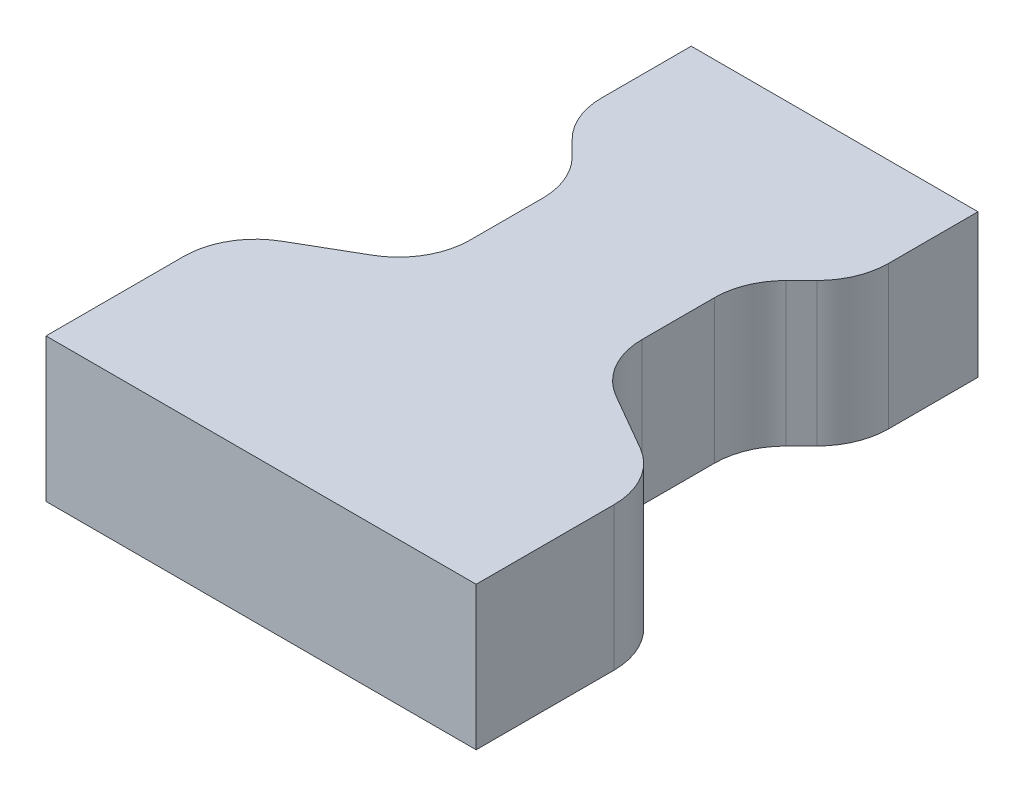
ISO-10303-21;
HEADER;
FILE_DESCRIPTION(('STEP AP214'),'2;1');
FILE_NAME('part.step','',(''),(''),'','','');
FILE_SCHEMA(('AUTOMOTIVE_DESIGN { 1 0 10303 214 1 1 1 1 }'));
ENDSEC;
DATA;
#1=APPLICATION_CONTEXT('core data for automotive mechanical design processes');
#2=APPLICATION_PROTOCOL_DEFINITION('international standard','automotive_design',2000,#1);
#3=PRODUCT_CONTEXT('',#1,'mechanical');
#4=PRODUCT('Part','Part','',(#3));
#5=PRODUCT_RELATED_PRODUCT_CATEGORY('part','',(#4));
#6=PRODUCT_DEFINITION_FORMATION('','',#4);
#7=PRODUCT_DEFINITION_CONTEXT('part definition',#1,'design');
#8=PRODUCT_DEFINITION('design','',#6,#7);
#9=PRODUCT_DEFINITION_SHAPE('','',#8);
#10=(LENGTH_UNIT() NAMED_UNIT(*) SI_UNIT(.MILLI.,.METRE.));
#11=(NAMED_UNIT(*) PLANE_ANGLE_UNIT() SI_UNIT($,.RADIAN.));
#12=(NAMED_UNIT(*) SI_UNIT($,.STERADIAN.) SOLID_ANGLE_UNIT());
#13=UNCERTAINTY_MEASURE_WITH_UNIT(LENGTH_MEASURE(1.E-05),#10,'distance_accuracy_value','');
#14=(GEOMETRIC_REPRESENTATION_CONTEXT(3) GLOBAL_UNCERTAINTY_ASSIGNED_CONTEXT((#13)) GLOBAL_UNIT_ASSIGNED_CONTEXT((#10,
#11,#12)) REPRESENTATION_CONTEXT('',''));
#15=CARTESIAN_POINT('',(0.,0.,0.));
#16=DIRECTION('',(0.,0.,1.));
#17=DIRECTION('',(1.,0.,0.));
#18=AXIS2_PLACEMENT_3D('',#15,#16,#17);
#19=CARTESIAN_POINT('',(300.,100.,0.));
#20=DIRECTION('',(-1.,0.,0.));
#21=DIRECTION('',(0.,0.,1.));
#22=AXIS2_PLACEMENT_3D('',#19,#20,#21);
#23=PLANE('',#22);
#24=DIRECTION('',(0.,0.,-1.));
#25=VECTOR('',#24,1.);
#26=CARTESIAN_POINT('',(300.,-100.,0.));
#27=LINE('',#26,#25);
#28=CARTESIAN_POINT('',(300.,-100.,0.));
#29=VERTEX_POINT('',#28);
#30=CARTESIAN_POINT('',(300.,-100.,-192.264973081037));
#31=VERTEX_POINT('',#30);
#32=EDGE_CURVE('E212',#29,#31,#27,.T.);
#33=ORIENTED_EDGE('',*,*,#32,.T.);
#34=DIRECTION('',(0.,-1.,0.));
#35=VECTOR('',#34,1.);
#36=CARTESIAN_POINT('',(300.,100.,-192.264973081037));
#37=LINE('',#36,#35);
#38=CARTESIAN_POINT('',(300.,100.,-192.264973081037));
#39=VERTEX_POINT('',#38);
#40=EDGE_CURVE('E11',#39,#31,#37,.T.);
#41=ORIENTED_EDGE('',*,*,#40,.F.);
#42=DIRECTION('',(0.,0.,-1.));
#43=VECTOR('',#42,1.);
#44=CARTESIAN_POINT('',(300.,100.,0.));
#45=LINE('',#44,#43);
#46=CARTESIAN_POINT('',(300.,100.,0.));
#47=VERTEX_POINT('',#46);
#48=EDGE_CURVE('E270',#47,#39,#45,.T.);
#49=ORIENTED_EDGE('',*,*,#48,.F.);
#50=DIRECTION('',(0.,-1.,0.));
#51=VECTOR('',#50,1.);
#52=CARTESIAN_POINT('',(300.,100.,0.));
#53=LINE('',#52,#51);
#54=EDGE_CURVE('E208',#47,#29,#53,.T.);
#55=ORIENTED_EDGE('',*,*,#54,.T.);
#56=EDGE_LOOP('',(#33,#41,#49,#55));
#57=FACE_BOUND('',#56,.T.);
#58=ADVANCED_FACE('F39',(#57),#23,.F.);
#59=CARTESIAN_POINT('',(200.,100.,-192.264973081037));
#60=DIRECTION('',(0.,-1.,0.));
#61=DIRECTION('',(0.,0.,-1.));
#62=AXIS2_PLACEMENT_3D('',#59,#60,#61);
#63=CYLINDRICAL_SURFACE('',#62,100.);
#64=CARTESIAN_POINT('',(200.,-100.,-192.264973081037));
#65=DIRECTION('',(0.,1.,0.));
#66=DIRECTION('',(0.,0.,-1.));
#67=AXIS2_PLACEMENT_3D('',#64,#65,#66);
#68=CIRCLE('',#67,100.);
#69=CARTESIAN_POINT('',(250.,-100.,-278.867513459481));
#70=VERTEX_POINT('',#69);
#71=EDGE_CURVE('E216',#31,#70,#68,.T.);
#72=ORIENTED_EDGE('',*,*,#71,.T.);
#73=DIRECTION('',(0.,-1.,0.));
#74=VECTOR('',#73,1.);
#75=CARTESIAN_POINT('',(250.,100.,-278.867513459481));
#76=LINE('',#75,#74);
#77=CARTESIAN_POINT('',(250.,100.,-278.867513459481));
#78=VERTEX_POINT('',#77);
#79=EDGE_CURVE('E48',#78,#70,#76,.T.);
#80=ORIENTED_EDGE('',*,*,#79,.F.);
#81=CARTESIAN_POINT('',(200.,100.,-192.264973081037));
#82=DIRECTION('',(0.,1.,0.));
#83=DIRECTION('',(0.,0.,-1.));
#84=AXIS2_PLACEMENT_3D('',#81,#82,#83);
#85=CIRCLE('',#84,100.);
#86=EDGE_CURVE('E135',#39,#78,#85,.T.);
#87=ORIENTED_EDGE('',*,*,#86,.F.);
#88=ORIENTED_EDGE('',*,*,#40,.T.);
#89=EDGE_LOOP('',(#72,#80,#87,#88));
#90=FACE_BOUND('',#89,.T.);
#91=ADVANCED_FACE('F420',(#90),#63,.T.);
#92=CARTESIAN_POINT('',(250.,100.,-278.867513459481));
#93=DIRECTION('',(-0.499999999999997,0.,0.86602540378444));
#94=DIRECTION('',(0.86602540378444,0.,0.499999999999997));
#95=AXIS2_PLACEMENT_3D('',#92,#93,#94);
#96=PLANE('',#95);
#97=DIRECTION('',(-0.86602540378444,0.,-0.499999999999997));
#98=VECTOR('',#97,1.);
#99=CARTESIAN_POINT('',(250.,-100.,-278.867513459481));
#100=LINE('',#99,#98);
#101=CARTESIAN_POINT('',(170.,-100.,-325.055534994651));
#102=VERTEX_POINT('',#101);
#103=EDGE_CURVE('E219',#70,#102,#100,.T.);
#104=ORIENTED_EDGE('',*,*,#103,.T.);
#105=DIRECTION('',(0.,-1.,0.));
#106=VECTOR('',#105,1.);
#107=CARTESIAN_POINT('',(170.,100.,-325.055534994651));
#108=LINE('',#107,#106);
#109=CARTESIAN_POINT('',(170.,100.,-325.055534994651));
#110=VERTEX_POINT('',#109);
#111=EDGE_CURVE('E329',#110,#102,#108,.T.);
#112=ORIENTED_EDGE('',*,*,#111,.F.);
#113=DIRECTION('',(-0.86602540378444,0.,-0.499999999999997));
#114=VECTOR('',#113,1.);
#115=CARTESIAN_POINT('',(250.,100.,-278.867513459481));
#116=LINE('',#115,#114);
#117=EDGE_CURVE('E339',#78,#110,#116,.T.);
#118=ORIENTED_EDGE('',*,*,#117,.F.);
#119=ORIENTED_EDGE('',*,*,#79,.T.);
#120=EDGE_LOOP('',(#104,#112,#118,#119));
#121=FACE_BOUND('',#120,.T.);
#122=ADVANCED_FACE('F337',(#121),#96,.F.);
#123=CARTESIAN_POINT('',(220.,100.,-411.658075373095));
#124=DIRECTION('',(0.,-1.,0.));
#125=DIRECTION('',(0.,0.,-1.));
#126=AXIS2_PLACEMENT_3D('',#123,#124,#125);
#127=CYLINDRICAL_SURFACE('',#126,100.);
#128=CARTESIAN_POINT('',(220.,-100.,-411.658075373095));
#129=DIRECTION('',(0.,-1.,0.));
#130=DIRECTION('',(0.,0.,-1.));
#131=AXIS2_PLACEMENT_3D('',#128,#129,#130);
#132=CIRCLE('',#131,100.);
#133=CARTESIAN_POINT('',(120.,-100.,-411.658075373095));
#134=VERTEX_POINT('',#133);
#135=EDGE_CURVE('E222',#102,#134,#132,.T.);
#136=ORIENTED_EDGE('',*,*,#135,.T.);
#137=DIRECTION('',(0.,-1.,0.));
#138=VECTOR('',#137,1.);
#139=CARTESIAN_POINT('',(120.,100.,-411.658075373095));
#140=LINE('',#139,#138);
#141=CARTESIAN_POINT('',(120.,100.,-411.658075373095));
#142=VERTEX_POINT('',#141);
#143=EDGE_CURVE('E325',#142,#134,#140,.T.);
#144=ORIENTED_EDGE('',*,*,#143,.F.);
#145=CARTESIAN_POINT('',(220.,100.,-411.658075373095));
#146=DIRECTION('',(0.,-1.,0.));
#147=DIRECTION('',(0.,0.,-1.));
#148=AXIS2_PLACEMENT_3D('',#145,#146,#147);
#149=CIRCLE('',#148,100.);
#150=EDGE_CURVE('E358',#110,#142,#149,.T.);
#151=ORIENTED_EDGE('',*,*,#150,.F.);
#152=ORIENTED_EDGE('',*,*,#111,.T.);
#153=EDGE_LOOP('',(#136,#144,#151,#152));
#154=FACE_BOUND('',#153,.T.);
#155=ADVANCED_FACE('F348',(#154),#127,.F.);
#156=CARTESIAN_POINT('',(120.,100.,-411.658075373095));
#157=DIRECTION('',(-1.,0.,0.));
#158=DIRECTION('',(0.,0.,1.));
#159=AXIS2_PLACEMENT_3D('',#156,#157,#158);
#160=PLANE('',#159);
#161=DIRECTION('',(0.,0.,-1.));
#162=VECTOR('',#161,1.);
#163=CARTESIAN_POINT('',(120.,-100.,-411.658075373095));
#164=LINE('',#163,#162);
#165=CARTESIAN_POINT('',(120.,-100.,-512.501692216822));
#166=VERTEX_POINT('',#165);
#167=EDGE_CURVE('E225',#134,#166,#164,.T.);
#168=ORIENTED_EDGE('',*,*,#167,.T.);
#169=DIRECTION('',(0.,-1.,0.));
#170=VECTOR('',#169,1.);
#171=CARTESIAN_POINT('',(120.,100.,-512.501692216822));
#172=LINE('',#171,#170);
#173=CARTESIAN_POINT('',(120.,100.,-512.501692216822));
#174=VERTEX_POINT('',#173);
#175=EDGE_CURVE('E321',#174,#166,#172,.T.);
#176=ORIENTED_EDGE('',*,*,#175,.F.);
#177=DIRECTION('',(0.,0.,-1.));
#178=VECTOR('',#177,1.);
#179=CARTESIAN_POINT('',(120.,100.,-411.658075373095));
#180=LINE('',#179,#178);
#181=EDGE_CURVE('E354',#142,#174,#180,.T.);
#182=ORIENTED_EDGE('',*,*,#181,.F.);
#183=ORIENTED_EDGE('',*,*,#143,.T.);
#184=EDGE_LOOP('',(#168,#176,#182,#183));
#185=FACE_BOUND('',#184,.T.);
#186=ADVANCED_FACE('F352',(#185),#160,.F.);
#187=CARTESIAN_POINT('',(220.,100.,-512.501692216822));
#188=DIRECTION('',(0.,-1.,0.));
#189=DIRECTION('',(0.,0.,-1.));
#190=AXIS2_PLACEMENT_3D('',#187,#188,#189);
#191=CYLINDRICAL_SURFACE('',#190,100.);
#192=CARTESIAN_POINT('',(220.,-100.,-512.501692216822));
#193=DIRECTION('',(0.,-1.,0.));
#194=DIRECTION('',(0.,0.,-1.));
#195=AXIS2_PLACEMENT_3D('',#192,#193,#194);
#196=CIRCLE('',#195,100.);
#197=CARTESIAN_POINT('',(149.289321881346,-100.,-583.212370335478));
#198=VERTEX_POINT('',#197);
#199=EDGE_CURVE('E228',#166,#198,#196,.T.);
#200=ORIENTED_EDGE('',*,*,#199,.T.);
#201=DIRECTION('',(0.,-1.,0.));
#202=VECTOR('',#201,1.);
#203=CARTESIAN_POINT('',(149.289321881346,100.,-583.212370335478));
#204=LINE('',#203,#202);
#205=CARTESIAN_POINT('',(149.289321881346,100.,-583.212370335478));
#206=VERTEX_POINT('',#205);
#207=EDGE_CURVE('E317',#206,#198,#204,.T.);
#208=ORIENTED_EDGE('',*,*,#207,.F.);
#209=CARTESIAN_POINT('',(220.,100.,-512.501692216822));
#210=DIRECTION('',(0.,-1.,0.));
#211=DIRECTION('',(0.,0.,-1.));
#212=AXIS2_PLACEMENT_3D('',#209,#210,#211);
#213=CIRCLE('',#212,100.);
#214=EDGE_CURVE('E357',#174,#206,#213,.T.);
#215=ORIENTED_EDGE('',*,*,#214,.F.);
#216=ORIENTED_EDGE('',*,*,#175,.T.);
#217=EDGE_LOOP('',(#200,#208,#215,#216));
#218=FACE_BOUND('',#217,.T.);
#219=ADVANCED_FACE('F433',(#218),#191,.F.);
#220=CARTESIAN_POINT('',(149.289321881346,100.,-583.212370335478));
#221=DIRECTION('',(-0.707106781186546,0.,-0.707106781186549));
#222=DIRECTION('',(-0.707106781186549,0.,0.707106781186546));
#223=AXIS2_PLACEMENT_3D('',#220,#221,#222);
#224=PLANE('',#223);
#225=DIRECTION('',(0.707106781186549,0.,-0.707106781186546));
#226=VECTOR('',#225,1.);
#227=CARTESIAN_POINT('',(149.289321881346,-100.,-583.212370335478));
#228=LINE('',#227,#226);
#229=CARTESIAN_POINT('',(170.710678118654,-100.,-604.633726572786));
#230=VERTEX_POINT('',#229);
#231=EDGE_CURVE('E231',#198,#230,#228,.T.);
#232=ORIENTED_EDGE('',*,*,#231,.T.);
#233=DIRECTION('',(0.,-1.,0.));
#234=VECTOR('',#233,1.);
#235=CARTESIAN_POINT('',(170.710678118654,100.,-604.633726572786));
#236=LINE('',#235,#234);
#237=CARTESIAN_POINT('',(170.710678118654,100.,-604.633726572786));
#238=VERTEX_POINT('',#237);
#239=EDGE_CURVE('E313',#238,#230,#236,.T.);
#240=ORIENTED_EDGE('',*,*,#239,.F.);
#241=DIRECTION('',(0.707106781186549,0.,-0.707106781186546));
#242=VECTOR('',#241,1.);
#243=CARTESIAN_POINT('',(149.289321881346,100.,-583.212370335478));
#244=LINE('',#243,#242);
#245=EDGE_CURVE('E362',#206,#238,#244,.T.);
#246=ORIENTED_EDGE('',*,*,#245,.F.);
#247=ORIENTED_EDGE('',*,*,#207,.T.);
#248=EDGE_LOOP('',(#232,#240,#246,#247));
#249=FACE_BOUND('',#248,.T.);
#250=ADVANCED_FACE('F436',(#249),#224,.F.);
#251=CARTESIAN_POINT('',(100.,100.,-675.344404691441));
#252=DIRECTION('',(0.,-1.,0.));
#253=DIRECTION('',(0.,0.,-1.));
#254=AXIS2_PLACEMENT_3D('',#251,#252,#253);
#255=CYLINDRICAL_SURFACE('',#254,100.);
#256=CARTESIAN_POINT('',(100.,-100.,-675.344404691441));
#257=DIRECTION('',(0.,1.,0.));
#258=DIRECTION('',(0.,0.,-1.));
#259=AXIS2_PLACEMENT_3D('',#256,#257,#258);
#260=CIRCLE('',#259,100.);
#261=CARTESIAN_POINT('',(200.,-100.,-675.344404691442));
#262=VERTEX_POINT('',#261);
#263=EDGE_CURVE('E234',#230,#262,#260,.T.);
#264=ORIENTED_EDGE('',*,*,#263,.T.);
#265=DIRECTION('',(0.,-1.,0.));
#266=VECTOR('',#265,1.);
#267=CARTESIAN_POINT('',(200.,100.,-675.344404691442));
#268=LINE('',#267,#266);
#269=CARTESIAN_POINT('',(200.,100.,-675.344404691442));
#270=VERTEX_POINT('',#269);
#271=EDGE_CURVE('E309',#270,#262,#268,.T.);
#272=ORIENTED_EDGE('',*,*,#271,.F.);
#273=CARTESIAN_POINT('',(100.,100.,-675.344404691441));
#274=DIRECTION('',(0.,1.,0.));
#275=DIRECTION('',(0.,0.,-1.));
#276=AXIS2_PLACEMENT_3D('',#273,#274,#275);
#277=CIRCLE('',#276,100.);
#278=EDGE_CURVE('E369',#238,#270,#277,.T.);
#279=ORIENTED_EDGE('',*,*,#278,.F.);
#280=ORIENTED_EDGE('',*,*,#239,.T.);
#281=EDGE_LOOP('',(#264,#272,#279,#280));
#282=FACE_BOUND('',#281,.T.);
#283=ADVANCED_FACE('F440',(#282),#255,.T.);
#284=CARTESIAN_POINT('',(200.,100.,-675.344404691442));
#285=DIRECTION('',(-1.,0.,0.));
#286=DIRECTION('',(0.,0.,1.));
#287=AXIS2_PLACEMENT_3D('',#284,#285,#286);
#288=PLANE('',#287);
#289=DIRECTION('',(0.,0.,-1.));
#290=VECTOR('',#289,1.);
#291=CARTESIAN_POINT('',(200.,-100.,-675.344404691442));
#292=LINE('',#291,#290);
#293=CARTESIAN_POINT('',(200.,-100.,-800.));
#294=VERTEX_POINT('',#293);
#295=EDGE_CURVE('E237',#262,#294,#292,.T.);
#296=ORIENTED_EDGE('',*,*,#295,.T.);
#297=DIRECTION('',(0.,-1.,0.));
#298=VECTOR('',#297,1.);
#299=CARTESIAN_POINT('',(200.,100.,-800.));
#300=LINE('',#299,#298);
#301=CARTESIAN_POINT('',(200.,100.,-800.));
#302=VERTEX_POINT('',#301);
#303=EDGE_CURVE('E305',#302,#294,#300,.T.);
#304=ORIENTED_EDGE('',*,*,#303,.F.);
#305=DIRECTION('',(0.,0.,-1.));
#306=VECTOR('',#305,1.);
#307=CARTESIAN_POINT('',(200.,100.,-675.344404691442));
#308=LINE('',#307,#306);
#309=EDGE_CURVE('E372',#270,#302,#308,.T.);
#310=ORIENTED_EDGE('',*,*,#309,.F.);
#311=ORIENTED_EDGE('',*,*,#271,.T.);
#312=EDGE_LOOP('',(#296,#304,#310,#311));
#313=FACE_BOUND('',#312,.T.);
#314=ADVANCED_FACE('F444',(#313),#288,.F.);
#315=CARTESIAN_POINT('',(200.,100.,-800.));
#316=DIRECTION('',(0.,0.,1.));
#317=DIRECTION('',(1.,0.,0.));
#318=AXIS2_PLACEMENT_3D('',#315,#316,#317);
#319=PLANE('',#318);
#320=DIRECTION('',(-1.,0.,0.));
#321=VECTOR('',#320,1.);
#322=CARTESIAN_POINT('',(200.,-100.,-800.));
#323=LINE('',#322,#321);
#324=CARTESIAN_POINT('',(-200.,-100.,-800.));
#325=VERTEX_POINT('',#324);
#326=EDGE_CURVE('E240',#294,#325,#323,.T.);
#327=ORIENTED_EDGE('',*,*,#326,.T.);
#328=DIRECTION('',(0.,-1.,0.));
#329=VECTOR('',#328,1.);
#330=CARTESIAN_POINT('',(-200.,100.,-800.));
#331=LINE('',#330,#329);
#332=CARTESIAN_POINT('',(-200.,100.,-800.));
#333=VERTEX_POINT('',#332);
#334=EDGE_CURVE('E301',#333,#325,#331,.T.);
#335=ORIENTED_EDGE('',*,*,#334,.F.);
#336=DIRECTION('',(-1.,0.,0.));
#337=VECTOR('',#336,1.);
#338=CARTESIAN_POINT('',(200.,100.,-800.));
#339=LINE('',#338,#337);
#340=EDGE_CURVE('E375',#302,#333,#339,.T.);
#341=ORIENTED_EDGE('',*,*,#340,.F.);
#342=ORIENTED_EDGE('',*,*,#303,.T.);
#343=EDGE_LOOP('',(#327,#335,#341,#342));
#344=FACE_BOUND('',#343,.T.);
#345=ADVANCED_FACE('F448',(#344),#319,.F.);
#346=CARTESIAN_POINT('',(-200.,100.,-675.344404691442));
#347=DIRECTION('',(1.,0.,0.));
#348=DIRECTION('',(0.,0.,-1.));
#349=AXIS2_PLACEMENT_3D('',#346,#347,#348);
#350=PLANE('',#349);
#351=DIRECTION('',(0.,0.,1.));
#352=VECTOR('',#351,1.);
#353=CARTESIAN_POINT('',(-200.,-100.,-675.344404691442));
#354=LINE('',#353,#352);
#355=CARTESIAN_POINT('',(-200.,-100.,-675.344404691442));
#356=VERTEX_POINT('',#355);
#357=EDGE_CURVE('E243',#325,#356,#354,.T.);
#358=ORIENTED_EDGE('',*,*,#357,.T.);
#359=DIRECTION('',(0.,-1.,0.));
#360=VECTOR('',#359,1.);
#361=CARTESIAN_POINT('',(-200.,100.,-675.344404691442));
#362=LINE('',#361,#360);
#363=CARTESIAN_POINT('',(-200.,100.,-675.344404691442));
#364=VERTEX_POINT('',#363);
#365=EDGE_CURVE('E297',#364,#356,#362,.T.);
#366=ORIENTED_EDGE('',*,*,#365,.F.);
#367=DIRECTION('',(0.,0.,1.));
#368=VECTOR('',#367,1.);
#369=CARTESIAN_POINT('',(-200.,100.,-675.344404691442));
#370=LINE('',#369,#368);
#371=EDGE_CURVE('E378',#333,#364,#370,.T.);
#372=ORIENTED_EDGE('',*,*,#371,.F.);
#373=ORIENTED_EDGE('',*,*,#334,.T.);
#374=EDGE_LOOP('',(#358,#366,#372,#373));
#375=FACE_BOUND('',#374,.T.);
#376=ADVANCED_FACE('F452',(#375),#350,.F.);
#377=CARTESIAN_POINT('',(-100.,100.,-675.344404691441));
#378=DIRECTION('',(0.,-1.,0.));
#379=DIRECTION('',(0.,0.,-1.));
#380=AXIS2_PLACEMENT_3D('',#377,#378,#379);
#381=CYLINDRICAL_SURFACE('',#380,100.);
#382=CARTESIAN_POINT('',(-100.,-100.,-675.344404691441));
#383=DIRECTION('',(0.,1.,0.));
#384=DIRECTION('',(0.,0.,1.));
#385=AXIS2_PLACEMENT_3D('',#382,#383,#384);
#386=CIRCLE('',#385,100.);
#387=CARTESIAN_POINT('',(-170.710678118654,-100.,-604.633726572786));
#388=VERTEX_POINT('',#387);
#389=EDGE_CURVE('E246',#356,#388,#386,.T.);
#390=ORIENTED_EDGE('',*,*,#389,.T.);
#391=DIRECTION('',(0.,-1.,0.));
#392=VECTOR('',#391,1.);
#393=CARTESIAN_POINT('',(-170.710678118654,100.,-604.633726572786));
#394=LINE('',#393,#392);
#395=CARTESIAN_POINT('',(-170.710678118654,100.,-604.633726572786));
#396=VERTEX_POINT('',#395);
#397=EDGE_CURVE('E293',#396,#388,#394,.T.);
#398=ORIENTED_EDGE('',*,*,#397,.F.);
#399=CARTESIAN_POINT('',(-100.,100.,-675.344404691441));
#400=DIRECTION('',(0.,1.,0.));
#401=DIRECTION('',(0.,0.,1.));
#402=AXIS2_PLACEMENT_3D('',#399,#400,#401);
#403=CIRCLE('',#402,100.);
#404=EDGE_CURVE('E381',#364,#396,#403,.T.);
#405=ORIENTED_EDGE('',*,*,#404,.F.);
#406=ORIENTED_EDGE('',*,*,#365,.T.);
#407=EDGE_LOOP('',(#390,#398,#405,#406));
#408=FACE_BOUND('',#407,.T.);
#409=ADVANCED_FACE('F456',(#408),#381,.T.);
#410=CARTESIAN_POINT('',(-149.289321881346,100.,-583.212370335478));
#411=DIRECTION('',(0.707106781186546,0.,-0.707106781186549));
#412=DIRECTION('',(-0.707106781186549,0.,-0.707106781186546));
#413=AXIS2_PLACEMENT_3D('',#410,#411,#412);
#414=PLANE('',#413);
#415=DIRECTION('',(0.707106781186549,0.,0.707106781186546));
#416=VECTOR('',#415,1.);
#417=CARTESIAN_POINT('',(-149.289321881346,-100.,-583.212370335478));
#418=LINE('',#417,#416);
#419=CARTESIAN_POINT('',(-149.289321881346,-100.,-583.212370335478));
#420=VERTEX_POINT('',#419);
#421=EDGE_CURVE('E249',#388,#420,#418,.T.);
#422=ORIENTED_EDGE('',*,*,#421,.T.);
#423=DIRECTION('',(0.,-1.,0.));
#424=VECTOR('',#423,1.);
#425=CARTESIAN_POINT('',(-149.289321881346,100.,-583.212370335478));
#426=LINE('',#425,#424);
#427=CARTESIAN_POINT('',(-149.289321881346,100.,-583.212370335478));
#428=VERTEX_POINT('',#427);
#429=EDGE_CURVE('E289',#428,#420,#426,.T.);
#430=ORIENTED_EDGE('',*,*,#429,.F.);
#431=DIRECTION('',(0.707106781186549,0.,0.707106781186546));
#432=VECTOR('',#431,1.);
#433=CARTESIAN_POINT('',(-149.289321881346,100.,-583.212370335478));
#434=LINE('',#433,#432);
#435=EDGE_CURVE('E384',#396,#428,#434,.T.);
#436=ORIENTED_EDGE('',*,*,#435,.F.);
#437=ORIENTED_EDGE('',*,*,#397,.T.);
#438=EDGE_LOOP('',(#422,#430,#436,#437));
#439=FACE_BOUND('',#438,.T.);
#440=ADVANCED_FACE('F460',(#439),#414,.F.);
#441=CARTESIAN_POINT('',(-220.,100.,-512.501692216822));
#442=DIRECTION('',(0.,-1.,0.));
#443=DIRECTION('',(0.,0.,-1.));
#444=AXIS2_PLACEMENT_3D('',#441,#442,#443);
#445=CYLINDRICAL_SURFACE('',#444,100.);
#446=CARTESIAN_POINT('',(-220.,-100.,-512.501692216822));
#447=DIRECTION('',(0.,-1.,0.));
#448=DIRECTION('',(0.,0.,1.));
#449=AXIS2_PLACEMENT_3D('',#446,#447,#448);
#450=CIRCLE('',#449,100.);
#451=CARTESIAN_POINT('',(-120.,-100.,-512.501692216822));
#452=VERTEX_POINT('',#451);
#453=EDGE_CURVE('E252',#420,#452,#450,.T.);
#454=ORIENTED_EDGE('',*,*,#453,.T.);
#455=DIRECTION('',(0.,-1.,0.));
#456=VECTOR('',#455,1.);
#457=CARTESIAN_POINT('',(-120.,100.,-512.501692216822));
#458=LINE('',#457,#456);
#459=CARTESIAN_POINT('',(-120.,100.,-512.501692216822));
#460=VERTEX_POINT('',#459);
#461=EDGE_CURVE('E285',#460,#452,#458,.T.);
#462=ORIENTED_EDGE('',*,*,#461,.F.);
#463=CARTESIAN_POINT('',(-220.,100.,-512.501692216822));
#464=DIRECTION('',(0.,-1.,0.));
#465=DIRECTION('',(0.,0.,1.));
#466=AXIS2_PLACEMENT_3D('',#463,#464,#465);
#467=CIRCLE('',#466,100.);
#468=EDGE_CURVE('E387',#428,#460,#467,.T.);
#469=ORIENTED_EDGE('',*,*,#468,.F.);
#470=ORIENTED_EDGE('',*,*,#429,.T.);
#471=EDGE_LOOP('',(#454,#462,#469,#470));
#472=FACE_BOUND('',#471,.T.);
#473=ADVANCED_FACE('F464',(#472),#445,.F.);
#474=CARTESIAN_POINT('',(-120.,100.,-411.658075373095));
#475=DIRECTION('',(1.,0.,0.));
#476=DIRECTION('',(0.,0.,-1.));
#477=AXIS2_PLACEMENT_3D('',#474,#475,#476);
#478=PLANE('',#477);
#479=DIRECTION('',(0.,0.,1.));
#480=VECTOR('',#479,1.);
#481=CARTESIAN_POINT('',(-120.,-100.,-411.658075373095));
#482=LINE('',#481,#480);
#483=CARTESIAN_POINT('',(-120.,-100.,-411.658075373095));
#484=VERTEX_POINT('',#483);
#485=EDGE_CURVE('E255',#452,#484,#482,.T.);
#486=ORIENTED_EDGE('',*,*,#485,.T.);
#487=DIRECTION('',(0.,-1.,0.));
#488=VECTOR('',#487,1.);
#489=CARTESIAN_POINT('',(-120.,100.,-411.658075373095));
#490=LINE('',#489,#488);
#491=CARTESIAN_POINT('',(-120.,100.,-411.658075373095));
#492=VERTEX_POINT('',#491);
#493=EDGE_CURVE('E281',#492,#484,#490,.T.);
#494=ORIENTED_EDGE('',*,*,#493,.F.);
#495=DIRECTION('',(0.,0.,1.));
#496=VECTOR('',#495,1.);
#497=CARTESIAN_POINT('',(-120.,100.,-411.658075373095));
#498=LINE('',#497,#496);
#499=EDGE_CURVE('E390',#460,#492,#498,.T.);
#500=ORIENTED_EDGE('',*,*,#499,.F.);
#501=ORIENTED_EDGE('',*,*,#461,.T.);
#502=EDGE_LOOP('',(#486,#494,#500,#501));
#503=FACE_BOUND('',#502,.T.);
#504=ADVANCED_FACE('F468',(#503),#478,.F.);
#505=CARTESIAN_POINT('',(-220.,100.,-411.658075373095));
#506=DIRECTION('',(0.,-1.,0.));
#507=DIRECTION('',(0.,0.,-1.));
#508=AXIS2_PLACEMENT_3D('',#505,#506,#507);
#509=CYLINDRICAL_SURFACE('',#508,100.);
#510=CARTESIAN_POINT('',(-220.,-100.,-411.658075373095));
#511=DIRECTION('',(0.,-1.,0.));
#512=DIRECTION('',(0.,0.,1.));
#513=AXIS2_PLACEMENT_3D('',#510,#511,#512);
#514=CIRCLE('',#513,100.);
#515=CARTESIAN_POINT('',(-170.,-100.,-325.055534994651));
#516=VERTEX_POINT('',#515);
#517=EDGE_CURVE('E258',#484,#516,#514,.T.);
#518=ORIENTED_EDGE('',*,*,#517,.T.);
#519=DIRECTION('',(0.,-1.,0.));
#520=VECTOR('',#519,1.);
#521=CARTESIAN_POINT('',(-170.,100.,-325.055534994651));
#522=LINE('',#521,#520);
#523=CARTESIAN_POINT('',(-170.,100.,-325.055534994651));
#524=VERTEX_POINT('',#523);
#525=EDGE_CURVE('E277',#524,#516,#522,.T.);
#526=ORIENTED_EDGE('',*,*,#525,.F.);
#527=CARTESIAN_POINT('',(-220.,100.,-411.658075373095));
#528=DIRECTION('',(0.,-1.,0.));
#529=DIRECTION('',(0.,0.,1.));
#530=AXIS2_PLACEMENT_3D('',#527,#528,#529);
#531=CIRCLE('',#530,100.);
#532=EDGE_CURVE('E393',#492,#524,#531,.T.);
#533=ORIENTED_EDGE('',*,*,#532,.F.);
#534=ORIENTED_EDGE('',*,*,#493,.T.);
#535=EDGE_LOOP('',(#518,#526,#533,#534));
#536=FACE_BOUND('',#535,.T.);
#537=ADVANCED_FACE('F401',(#536),#509,.F.);
#538=CARTESIAN_POINT('',(-250.,100.,-278.867513459481));
#539=DIRECTION('',(0.499999999999997,0.,0.86602540378444));
#540=DIRECTION('',(0.86602540378444,0.,-0.499999999999997));
#541=AXIS2_PLACEMENT_3D('',#538,#539,#540);
#542=PLANE('',#541);
#543=DIRECTION('',(-0.86602540378444,0.,0.499999999999997));
#544=VECTOR('',#543,1.);
#545=CARTESIAN_POINT('',(-250.,-100.,-278.867513459481));
#546=LINE('',#545,#544);
#547=CARTESIAN_POINT('',(-250.,-100.,-278.867513459481));
#548=VERTEX_POINT('',#547);
#549=EDGE_CURVE('E261',#516,#548,#546,.T.);
#550=ORIENTED_EDGE('',*,*,#549,.T.);
#551=DIRECTION('',(0.,-1.,0.));
#552=VECTOR('',#551,1.);
#553=CARTESIAN_POINT('',(-250.,100.,-278.867513459481));
#554=LINE('',#553,#552);
#555=CARTESIAN_POINT('',(-250.,100.,-278.867513459481));
#556=VERTEX_POINT('',#555);
#557=EDGE_CURVE('E201',#556,#548,#554,.T.);
#558=ORIENTED_EDGE('',*,*,#557,.F.);
#559=DIRECTION('',(-0.86602540378444,0.,0.499999999999997));
#560=VECTOR('',#559,1.);
#561=CARTESIAN_POINT('',(-250.,100.,-278.867513459481));
#562=LINE('',#561,#560);
#563=EDGE_CURVE('E190',#524,#556,#562,.T.);
#564=ORIENTED_EDGE('',*,*,#563,.F.);
#565=ORIENTED_EDGE('',*,*,#525,.T.);
#566=EDGE_LOOP('',(#550,#558,#564,#565));
#567=FACE_BOUND('',#566,.T.);
#568=ADVANCED_FACE('F405',(#567),#542,.F.);
#569=CARTESIAN_POINT('',(-200.,100.,-192.264973081037));
#570=DIRECTION('',(0.,-1.,0.));
#571=DIRECTION('',(0.,0.,-1.));
#572=AXIS2_PLACEMENT_3D('',#569,#570,#571);
#573=CYLINDRICAL_SURFACE('',#572,100.);
#574=CARTESIAN_POINT('',(-200.,-100.,-192.264973081037));
#575=DIRECTION('',(0.,1.,0.));
#576=DIRECTION('',(0.,0.,1.));
#577=AXIS2_PLACEMENT_3D('',#574,#575,#576);
#578=CIRCLE('',#577,100.);
#579=CARTESIAN_POINT('',(-300.,-100.,-192.264973081037));
#580=VERTEX_POINT('',#579);
#581=EDGE_CURVE('E199',#548,#580,#578,.T.);
#582=ORIENTED_EDGE('',*,*,#581,.T.);
#583=DIRECTION('',(0.,-1.,0.));
#584=VECTOR('',#583,1.);
#585=CARTESIAN_POINT('',(-300.,100.,-192.264973081037));
#586=LINE('',#585,#584);
#587=CARTESIAN_POINT('',(-300.,100.,-192.264973081037));
#588=VERTEX_POINT('',#587);
#589=EDGE_CURVE('E196',#588,#580,#586,.T.);
#590=ORIENTED_EDGE('',*,*,#589,.F.);
#591=CARTESIAN_POINT('',(-200.,100.,-192.264973081037));
#592=DIRECTION('',(0.,1.,0.));
#593=DIRECTION('',(0.,0.,1.));
#594=AXIS2_PLACEMENT_3D('',#591,#592,#593);
#595=CIRCLE('',#594,100.);
#596=EDGE_CURVE('E184',#556,#588,#595,.T.);
#597=ORIENTED_EDGE('',*,*,#596,.F.);
#598=ORIENTED_EDGE('',*,*,#557,.T.);
#599=EDGE_LOOP('',(#582,#590,#597,#598));
#600=FACE_BOUND('',#599,.T.);
#601=ADVANCED_FACE('F197',(#600),#573,.T.);
#602=CARTESIAN_POINT('',(-300.,100.,0.));
#603=DIRECTION('',(1.,0.,0.));
#604=DIRECTION('',(0.,0.,-1.));
#605=AXIS2_PLACEMENT_3D('',#602,#603,#604);
#606=PLANE('',#605);
#607=DIRECTION('',(0.,0.,1.));
#608=VECTOR('',#607,1.);
#609=CARTESIAN_POINT('',(-300.,-100.,0.));
#610=LINE('',#609,#608);
#611=CARTESIAN_POINT('',(-300.,-100.,0.));
#612=VERTEX_POINT('',#611);
#613=EDGE_CURVE('E121',#580,#612,#610,.T.);
#614=ORIENTED_EDGE('',*,*,#613,.T.);
#615=DIRECTION('',(0.,-1.,0.));
#616=VECTOR('',#615,1.);
#617=CARTESIAN_POINT('',(-300.,100.,0.));
#618=LINE('',#617,#616);
#619=CARTESIAN_POINT('',(-300.,100.,0.));
#620=VERTEX_POINT('',#619);
#621=EDGE_CURVE('E202',#620,#612,#618,.T.);
#622=ORIENTED_EDGE('',*,*,#621,.F.);
#623=DIRECTION('',(0.,0.,1.));
#624=VECTOR('',#623,1.);
#625=CARTESIAN_POINT('',(-300.,100.,0.));
#626=LINE('',#625,#624);
#627=EDGE_CURVE('E188',#588,#620,#626,.T.);
#628=ORIENTED_EDGE('',*,*,#627,.F.);
#629=ORIENTED_EDGE('',*,*,#589,.T.);
#630=EDGE_LOOP('',(#614,#622,#628,#629));
#631=FACE_BOUND('',#630,.T.);
#632=ADVANCED_FACE('F204',(#631),#606,.F.);
#633=CARTESIAN_POINT('',(-300.,100.,0.));
#634=DIRECTION('',(0.,0.,-1.));
#635=DIRECTION('',(-1.,0.,0.));
#636=AXIS2_PLACEMENT_3D('',#633,#634,#635);
#637=PLANE('',#636);
#638=DIRECTION('',(1.,0.,0.));
#639=VECTOR('',#638,1.);
#640=CARTESIAN_POINT('',(-300.,-100.,0.));
#641=LINE('',#640,#639);
#642=EDGE_CURVE('E127',#612,#29,#641,.T.);
#643=ORIENTED_EDGE('',*,*,#642,.T.);
#644=ORIENTED_EDGE('',*,*,#54,.F.);
#645=DIRECTION('',(1.,0.,0.));
#646=VECTOR('',#645,1.);
#647=CARTESIAN_POINT('',(-300.,100.,0.));
#648=LINE('',#647,#646);
#649=EDGE_CURVE('E56',#620,#47,#648,.T.);
#650=ORIENTED_EDGE('',*,*,#649,.F.);
#651=ORIENTED_EDGE('',*,*,#621,.T.);
#652=EDGE_LOOP('',(#643,#644,#650,#651));
#653=FACE_BOUND('',#652,.T.);
#654=ADVANCED_FACE('F409',(#653),#637,.F.);
#655=CARTESIAN_POINT('',(200.,100.,-192.264973081037));
#656=DIRECTION('',(0.,-1.,0.));
#657=DIRECTION('',(0.,0.,-1.));
#658=AXIS2_PLACEMENT_3D('',#655,#656,#657);
#659=PLANE('',#658);
#660=ORIENTED_EDGE('',*,*,#48,.T.);
#661=ORIENTED_EDGE('',*,*,#86,.T.);
#662=ORIENTED_EDGE('',*,*,#117,.T.);
#663=ORIENTED_EDGE('',*,*,#150,.T.);
#664=ORIENTED_EDGE('',*,*,#181,.T.);
#665=ORIENTED_EDGE('',*,*,#214,.T.);
#666=ORIENTED_EDGE('',*,*,#245,.T.);
#667=ORIENTED_EDGE('',*,*,#278,.T.);
#668=ORIENTED_EDGE('',*,*,#309,.T.);
#669=ORIENTED_EDGE('',*,*,#340,.T.);
#670=ORIENTED_EDGE('',*,*,#371,.T.);
#671=ORIENTED_EDGE('',*,*,#404,.T.);
#672=ORIENTED_EDGE('',*,*,#435,.T.);
#673=ORIENTED_EDGE('',*,*,#468,.T.);
#674=ORIENTED_EDGE('',*,*,#499,.T.);
#675=ORIENTED_EDGE('',*,*,#532,.T.);
#676=ORIENTED_EDGE('',*,*,#563,.T.);
#677=ORIENTED_EDGE('',*,*,#596,.T.);
#678=ORIENTED_EDGE('',*,*,#627,.T.);
#679=ORIENTED_EDGE('',*,*,#649,.T.);
#680=EDGE_LOOP('',(#660,#661,#662,#663,#664,#665,#666,#667,#668,#669,#670,#671,#672,#673,#674,
#675,#676,#677,#678,#679));
#681=FACE_BOUND('',#680,.T.);
#682=ADVANCED_FACE('F186',(#681),#659,.F.);
#683=CARTESIAN_POINT('',(200.,-100.,-192.264973081037));
#684=DIRECTION('',(0.,-1.,0.));
#685=DIRECTION('',(0.,0.,-1.));
#686=AXIS2_PLACEMENT_3D('',#683,#684,#685);
#687=PLANE('',#686);
#688=ORIENTED_EDGE('',*,*,#32,.F.);
#689=ORIENTED_EDGE('',*,*,#642,.F.);
#690=ORIENTED_EDGE('',*,*,#613,.F.);
#691=ORIENTED_EDGE('',*,*,#581,.F.);
#692=ORIENTED_EDGE('',*,*,#549,.F.);
#693=ORIENTED_EDGE('',*,*,#517,.F.);
#694=ORIENTED_EDGE('',*,*,#485,.F.);
#695=ORIENTED_EDGE('',*,*,#453,.F.);
#696=ORIENTED_EDGE('',*,*,#421,.F.);
#697=ORIENTED_EDGE('',*,*,#389,.F.);
#698=ORIENTED_EDGE('',*,*,#357,.F.);
#699=ORIENTED_EDGE('',*,*,#326,.F.);
#700=ORIENTED_EDGE('',*,*,#295,.F.);
#701=ORIENTED_EDGE('',*,*,#263,.F.);
#702=ORIENTED_EDGE('',*,*,#231,.F.);
#703=ORIENTED_EDGE('',*,*,#199,.F.);
#704=ORIENTED_EDGE('',*,*,#167,.F.);
#705=ORIENTED_EDGE('',*,*,#135,.F.);
#706=ORIENTED_EDGE('',*,*,#103,.F.);
#707=ORIENTED_EDGE('',*,*,#71,.F.);
#708=EDGE_LOOP('',(#688,#689,#690,#691,#692,#693,#694,#695,#696,#697,#698,#699,#700,#701,#702,
#703,#704,#705,#706,#707));
#709=FACE_BOUND('',#708,.T.);
#710=ADVANCED_FACE('F343',(#709),#687,.T.);
#711=CLOSED_SHELL('',(#58,#91,#122,#155,#186,#219,#250,#283,#314,#345,#376,#409,#440,#473,#504,
#537,#568,#601,#632,#654,#682,#710));
#712=MANIFOLD_SOLID_BREP('B2',#711);
#713=ADVANCED_BREP_SHAPE_REPRESENTATION('',(#18,#712),#14);
#714=SHAPE_DEFINITION_REPRESENTATION(#9,#713);
ENDSEC;
END-ISO-10303-21;
